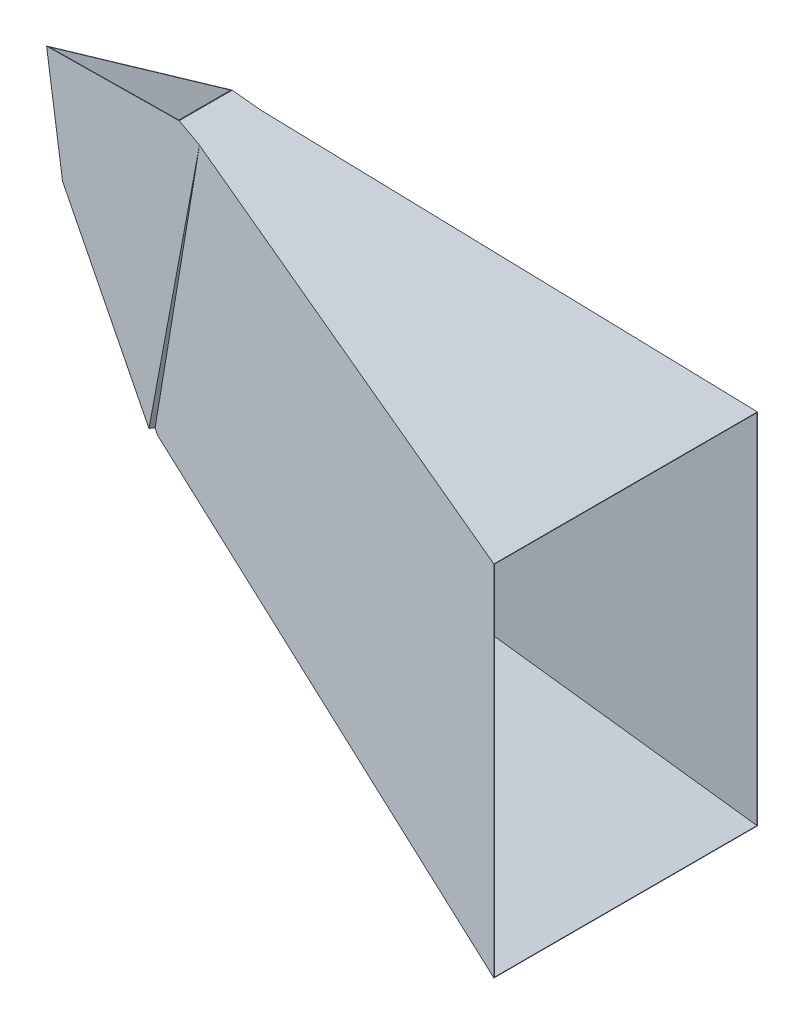
ISO-10303-21;
HEADER;
FILE_DESCRIPTION(('STEP AP214'),'2;1');
FILE_NAME('part.step','',(''),(''),'','','');
FILE_SCHEMA(('AUTOMOTIVE_DESIGN { 1 0 10303 214 1 1 1 1 }'));
ENDSEC;
DATA;
#1=APPLICATION_CONTEXT('core data for automotive mechanical design processes');
#2=APPLICATION_PROTOCOL_DEFINITION('international standard','automotive_design',2000,#1);
#3=PRODUCT_CONTEXT('',#1,'mechanical');
#4=PRODUCT('Part','Part','',(#3));
#5=PRODUCT_RELATED_PRODUCT_CATEGORY('part','',(#4));
#6=PRODUCT_DEFINITION_FORMATION('','',#4);
#7=PRODUCT_DEFINITION_CONTEXT('part definition',#1,'design');
#8=PRODUCT_DEFINITION('design','',#6,#7);
#9=PRODUCT_DEFINITION_SHAPE('','',#8);
#10=(LENGTH_UNIT() NAMED_UNIT(*) SI_UNIT(.MILLI.,.METRE.));
#11=(NAMED_UNIT(*) PLANE_ANGLE_UNIT() SI_UNIT($,.RADIAN.));
#12=(NAMED_UNIT(*) SI_UNIT($,.STERADIAN.) SOLID_ANGLE_UNIT());
#13=UNCERTAINTY_MEASURE_WITH_UNIT(LENGTH_MEASURE(1.E-05),#10,'distance_accuracy_value','');
#14=(GEOMETRIC_REPRESENTATION_CONTEXT(3) GLOBAL_UNCERTAINTY_ASSIGNED_CONTEXT((#13)) GLOBAL_UNIT_ASSIGNED_CONTEXT((#10,
#11,#12)) REPRESENTATION_CONTEXT('',''));
#15=CARTESIAN_POINT('',(0.,0.,0.));
#16=DIRECTION('',(0.,0.,1.));
#17=DIRECTION('',(1.,0.,0.));
#18=AXIS2_PLACEMENT_3D('',#15,#16,#17);
#19=CARTESIAN_POINT('',(-2618.,2991.,-821.33));
#20=DIRECTION('',(-0.17380459295499,0.984780159968584,0.));
#21=DIRECTION('',(-0.984780159968584,-0.17380459295499,0.));
#22=AXIS2_PLACEMENT_3D('',#19,#20,#21);
#23=PLANE('',#22);
#24=DIRECTION('',(0.,0.,1.));
#25=VECTOR('',#24,1.);
#26=CARTESIAN_POINT('',(-2618.,2991.,-821.33));
#27=LINE('',#26,#25);
#28=CARTESIAN_POINT('',(-2618.,2991.,-165.16039801311));
#29=VERTEX_POINT('',#28);
#30=CARTESIAN_POINT('',(-2618.,2991.,165.118310269719));
#31=VERTEX_POINT('',#30);
#32=EDGE_CURVE('E354',#29,#31,#27,.T.);
#33=ORIENTED_EDGE('',*,*,#32,.F.);
#34=DIRECTION('',(-0.971798950171605,-0.171513529450117,0.161832968399307));
#35=VECTOR('',#34,1.);
#36=CARTESIAN_POINT('',(-2514.80479147807,3009.213000161,-182.345420611396));
#37=LINE('',#36,#35);
#38=CARTESIAN_POINT('',(-3609.78,2815.96,-2.22044604925031E-13));
#39=VERTEX_POINT('',#38);
#40=EDGE_CURVE('E283',#29,#39,#37,.T.);
#41=ORIENTED_EDGE('',*,*,#40,.T.);
#42=DIRECTION('',(0.971805435159267,0.171514673990479,0.161792808248228));
#43=VECTOR('',#42,1.);
#44=CARTESIAN_POINT('',(-2773.10038292984,2963.62621647135,139.296138869245));
#45=LINE('',#44,#43);
#46=EDGE_CURVE('E302',#39,#31,#45,.T.);
#47=ORIENTED_EDGE('',*,*,#46,.T.);
#48=EDGE_LOOP('',(#33,#41,#47));
#49=FACE_BOUND('',#48,.T.);
#50=DIRECTION('',(-0.971798950171605,-0.171513529450117,0.161832968399307));
#51=VECTOR('',#50,1.);
#52=CARTESIAN_POINT('',(-2514.40620425464,3009.2833471206,-179.877369110171));
#53=LINE('',#52,#51);
#54=CARTESIAN_POINT('',(-2623.59288098615,2990.01290821773,-161.694591693098));
#55=VERTEX_POINT('',#54);
#56=CARTESIAN_POINT('',(-3594.55899883739,2818.64636597179,-0.00031425096982951));
#57=VERTEX_POINT('',#56);
#58=EDGE_CURVE('E207',#55,#57,#53,.T.);
#59=ORIENTED_EDGE('',*,*,#58,.F.);
#60=DIRECTION('',(0.,0.,1.));
#61=VECTOR('',#60,1.);
#62=CARTESIAN_POINT('',(-2623.59288098615,2990.01290821773,-821.33));
#63=LINE('',#62,#61);
#64=CARTESIAN_POINT('',(-2623.59288098615,2990.01290821773,161.652758717577));
#65=VERTEX_POINT('',#64);
#66=EDGE_CURVE('E180',#55,#65,#63,.T.);
#67=ORIENTED_EDGE('',*,*,#66,.T.);
#68=DIRECTION('',(0.971805435159267,0.171514673990479,0.161792808248228));
#69=VECTOR('',#68,1.);
#70=CARTESIAN_POINT('',(-2772.70189469963,2963.69654595956,136.828071397451));
#71=LINE('',#70,#69);
#72=EDGE_CURVE('E187',#57,#65,#71,.T.);
#73=ORIENTED_EDGE('',*,*,#72,.F.);
#74=EDGE_LOOP('',(#59,#67,#73));
#75=FACE_BOUND('',#74,.T.);
#76=ADVANCED_FACE('F38',(#49,#75),#23,.T.);
#77=CARTESIAN_POINT('',(-2819.61,1161.48,-821.33));
#78=DIRECTION('',(-0.828935245995771,-0.559344578900995,0.));
#79=DIRECTION('',(0.559344578900995,-0.828935245995771,0.));
#80=AXIS2_PLACEMENT_3D('',#77,#78,#79);
#81=PLANE('',#80);
#82=DIRECTION('',(0.,0.,1.));
#83=VECTOR('',#82,1.);
#84=CARTESIAN_POINT('',(-3490.66,2155.96,-821.33));
#85=LINE('',#84,#83);
#86=CARTESIAN_POINT('',(-3490.66,2155.96,-19.8369664757524));
#87=VERTEX_POINT('',#86);
#88=CARTESIAN_POINT('',(-3490.66,2155.96,19.8319114312941));
#89=VERTEX_POINT('',#88);
#90=EDGE_CURVE('E352',#87,#89,#85,.T.);
#91=ORIENTED_EDGE('',*,*,#90,.F.);
#92=DIRECTION('',(0.556933704736897,-0.825362388326875,-0.0927457625090863));
#93=VECTOR('',#92,1.);
#94=CARTESIAN_POINT('',(-2783.98250918488,1108.68091339568,-137.519452157992));
#95=LINE('',#94,#93);
#96=CARTESIAN_POINT('',(-2825.57183634467,1170.31529842493,-130.593611924464));
#97=VERTEX_POINT('',#96);
#98=EDGE_CURVE('E279',#87,#97,#95,.T.);
#99=ORIENTED_EDGE('',*,*,#98,.T.);
#100=DIRECTION('',(0.184023503464713,-0.272718416996628,0.944330458686696));
#101=VECTOR('',#100,1.);
#102=CARTESIAN_POINT('',(-2944.96200566314,1347.248664916,-743.253251766688));
#103=LINE('',#102,#101);
#104=CARTESIAN_POINT('',(-2819.61,1161.48,-100.));
#105=VERTEX_POINT('',#104);
#106=EDGE_CURVE('E321',#97,#105,#103,.T.);
#107=ORIENTED_EDGE('',*,*,#106,.T.);
#108=DIRECTION('',(0.,0.,1.));
#109=VECTOR('',#108,1.);
#110=CARTESIAN_POINT('',(-2819.61,1161.48,-821.33));
#111=LINE('',#110,#109);
#112=CARTESIAN_POINT('',(-2819.61,1161.48,100.));
#113=VERTEX_POINT('',#112);
#114=EDGE_CURVE('E48',#105,#113,#111,.T.);
#115=ORIENTED_EDGE('',*,*,#114,.T.);
#116=DIRECTION('',(0.553704431133627,-0.820576682324372,0.141652078588748));
#117=VECTOR('',#116,1.);
#118=CARTESIAN_POINT('',(-2891.87302930655,1268.57207567957,81.5132266768481));
#119=LINE('',#118,#117);
#120=CARTESIAN_POINT('',(-2837.89686803155,1188.58069967962,95.3217407665619));
#121=VERTEX_POINT('',#120);
#122=EDGE_CURVE('E333',#121,#113,#119,.T.);
#123=ORIENTED_EDGE('',*,*,#122,.F.);
#124=DIRECTION('',(0.181466893831261,-0.268929582858673,-0.945910485144707));
#125=VECTOR('',#124,1.);
#126=CARTESIAN_POINT('',(-2678.62752477108,952.547354197664,-734.882262682545));
#127=LINE('',#126,#125);
#128=CARTESIAN_POINT('',(-2844.06645933088,1197.72388596285,127.481221627709));
#129=VERTEX_POINT('',#128);
#130=EDGE_CURVE('E340',#129,#121,#127,.T.);
#131=ORIENTED_EDGE('',*,*,#130,.F.);
#132=DIRECTION('',(-0.556934925376517,0.825364197285507,-0.0927223313722426));
#133=VECTOR('',#132,1.);
#134=CARTESIAN_POINT('',(-2868.81716330611,1234.40383542905,123.360555332385));
#135=LINE('',#134,#133);
#136=EDGE_CURVE('E298',#129,#89,#135,.T.);
#137=ORIENTED_EDGE('',*,*,#136,.T.);
#138=EDGE_LOOP('',(#91,#99,#107,#115,#123,#131,#137));
#139=FACE_BOUND('',#138,.T.);
#140=ADVANCED_FACE('F377',(#139),#81,.T.);
#141=CARTESIAN_POINT('',(0.,2235.,-821.33));
#142=DIRECTION('',(0.277434275021273,0.960744619055148,0.));
#143=DIRECTION('',(-0.960744619055148,0.277434275021273,0.));
#144=AXIS2_PLACEMENT_3D('',#141,#142,#143);
#145=PLANE('',#144);
#146=DIRECTION('',(-0.932977433111524,0.269415943251456,0.238680034411261));
#147=VECTOR('',#146,1.);
#148=CARTESIAN_POINT('',(0.,2235.,-821.33));
#149=LINE('',#148,#147);
#150=CARTESIAN_POINT('',(0.,2235.,-821.33));
#151=VERTEX_POINT('',#150);
#152=CARTESIAN_POINT('',(-2465.88624153706,2947.07410183423,-190.491790954094));
#153=VERTEX_POINT('',#152);
#154=EDGE_CURVE('E317',#151,#153,#149,.T.);
#155=ORIENTED_EDGE('',*,*,#154,.T.);
#156=DIRECTION('',(-0.948679443110456,0.273950213518527,0.157982893797998));
#157=VECTOR('',#156,1.);
#158=CARTESIAN_POINT('',(33.0018992616001,2225.47003978542,-606.629805357033));
#159=LINE('',#158,#157);
#160=EDGE_CURVE('E275',#153,#29,#159,.T.);
#161=ORIENTED_EDGE('',*,*,#160,.T.);
#162=ORIENTED_EDGE('',*,*,#32,.T.);
#163=DIRECTION('',(0.948685476177381,-0.273951955687586,0.157943639520693));
#164=VECTOR('',#163,1.);
#165=CARTESIAN_POINT('',(-213.11740140898,2296.54192340152,565.499595510802));
#166=LINE('',#165,#164);
#167=CARTESIAN_POINT('',(-2466.4295960794,2947.23100635448,190.352786647815));
#168=VERTEX_POINT('',#167);
#169=EDGE_CURVE('E294',#31,#168,#166,.T.);
#170=ORIENTED_EDGE('',*,*,#169,.T.);
#171=DIRECTION('',(-0.932977433111524,0.269415943251456,-0.238680034411261));
#172=VECTOR('',#171,1.);
#173=CARTESIAN_POINT('',(-365.792597785915,2340.62994802374,727.750684221962));
#174=LINE('',#173,#172);
#175=CARTESIAN_POINT('',(0.,2235.,821.33));
#176=VERTEX_POINT('',#175);
#177=EDGE_CURVE('E329',#176,#168,#174,.T.);
#178=ORIENTED_EDGE('',*,*,#177,.F.);
#179=DIRECTION('',(0.,0.,1.));
#180=VECTOR('',#179,1.);
#181=CARTESIAN_POINT('',(0.,2235.,-821.33));
#182=LINE('',#181,#180);
#183=EDGE_CURVE('E42',#151,#176,#182,.T.);
#184=ORIENTED_EDGE('',*,*,#183,.F.);
#185=EDGE_LOOP('',(#155,#161,#162,#170,#178,#184));
#186=FACE_BOUND('',#185,.T.);
#187=ADVANCED_FACE('F366',(#186),#145,.T.);
#188=CARTESIAN_POINT('',(-3490.66,2155.96,-821.33));
#189=DIRECTION('',(-0.984100025713585,-0.177615144034852,0.));
#190=DIRECTION('',(0.177615144034852,-0.984100025713585,0.));
#191=AXIS2_PLACEMENT_3D('',#188,#189,#190);
#192=PLANE('',#191);
#193=DIRECTION('',(-0.17753753986495,0.983670049621115,-0.0295576625783375));
#194=VECTOR('',#193,1.);
#195=CARTESIAN_POINT('',(-3495.07407678685,2180.41677198894,19.0970257707184));
#196=LINE('',#195,#194);
#197=EDGE_CURVE('E306',#89,#39,#196,.T.);
#198=ORIENTED_EDGE('',*,*,#197,.T.);
#199=DIRECTION('',(0.177537500324102,-0.983669830539855,-0.0295651900782244));
#200=VECTOR('',#199,1.);
#201=CARTESIAN_POINT('',(-3486.45301921715,2132.65067061216,-20.5375519085386));
#202=LINE('',#201,#200);
#203=EDGE_CURVE('E287',#39,#87,#202,.T.);
#204=ORIENTED_EDGE('',*,*,#203,.T.);
#205=ORIENTED_EDGE('',*,*,#90,.T.);
#206=EDGE_LOOP('',(#198,#204,#205));
#207=FACE_BOUND('',#206,.T.);
#208=ADVANCED_FACE('F398',(#207),#192,.T.);
#209=CARTESIAN_POINT('',(-3324.72159323004,2991.,-3583.83713471968));
#210=DIRECTION('',(0.949160189456234,-0.200333170079366,-0.242820006830897));
#211=DIRECTION('',(-0.247844349608384,0.,-0.968799864970674));
#212=AXIS2_PLACEMENT_3D('',#209,#210,#211);
#213=PLANE('',#212);
#214=ORIENTED_EDGE('',*,*,#106,.F.);
#215=DIRECTION('',(0.198306109594362,0.979583644933264,-0.0330237713898608));
#216=VECTOR('',#215,1.);
#217=CARTESIAN_POINT('',(-2468.90488590454,2932.16273748797,-189.989098315412));
#218=LINE('',#217,#216);
#219=EDGE_CURVE('E251',#97,#153,#218,.T.);
#220=ORIENTED_EDGE('',*,*,#219,.T.);
#221=DIRECTION('',(0.194082748122037,0.979727830045647,-0.0496514442433065));
#222=VECTOR('',#221,1.);
#223=CARTESIAN_POINT('',(-2457.18458096532,2991.,-192.717903366879));
#224=LINE('',#223,#222);
#225=EDGE_CURVE('E313',#105,#153,#224,.T.);
#226=ORIENTED_EDGE('',*,*,#225,.F.);
#227=EDGE_LOOP('',(#214,#220,#226));
#228=FACE_BOUND('',#227,.T.);
#229=ADVANCED_FACE('F388',(#228),#213,.T.);
#230=CARTESIAN_POINT('',(-3322.04254062299,1161.48,1963.96076118556));
#231=DIRECTION('',(-0.946563572848116,0.213021143809366,-0.242155724374127));
#232=DIRECTION('',(-0.247844349608384,0.,0.968799864970674));
#233=AXIS2_PLACEMENT_3D('',#230,#231,#232);
#234=PLANE('',#233);
#235=DIRECTION('',(0.210863807382627,0.97688485512901,0.0351060472807063));
#236=VECTOR('',#235,1.);
#237=CARTESIAN_POINT('',(-2859.19012232568,1127.65933805832,124.96333088703));
#238=LINE('',#237,#236);
#239=EDGE_CURVE('E291',#129,#168,#238,.T.);
#240=ORIENTED_EDGE('',*,*,#239,.F.);
#241=ORIENTED_EDGE('',*,*,#130,.T.);
#242=DIRECTION('',(0.206374855358412,0.977047589572867,0.0527960868402664));
#243=VECTOR('',#242,1.);
#244=CARTESIAN_POINT('',(-2843.62115724343,1161.48,93.8573178367198));
#245=LINE('',#244,#243);
#246=EDGE_CURVE('E325',#121,#168,#245,.T.);
#247=ORIENTED_EDGE('',*,*,#246,.T.);
#248=EDGE_LOOP('',(#240,#241,#247));
#249=FACE_BOUND('',#248,.T.);
#250=ADVANCED_FACE('F373',(#249),#234,.F.);
#251=CARTESIAN_POINT('',(0.,0.,-821.33));
#252=DIRECTION('',(-0.380879933926362,-0.924624505370829,0.));
#253=DIRECTION('',(0.924624505370829,-0.380879933926362,0.));
#254=AXIS2_PLACEMENT_3D('',#251,#252,#253);
#255=PLANE('',#254);
#256=ORIENTED_EDGE('',*,*,#114,.F.);
#257=DIRECTION('',(-0.899794172231629,0.370651591944841,0.230190888192282));
#258=VECTOR('',#257,1.);
#259=CARTESIAN_POINT('',(-2819.61,1161.48,-100.));
#260=LINE('',#259,#258);
#261=CARTESIAN_POINT('',(0.,0.,-821.33));
#262=VERTEX_POINT('',#261);
#263=EDGE_CURVE('E310',#262,#105,#260,.T.);
#264=ORIENTED_EDGE('',*,*,#263,.F.);
#265=DIRECTION('',(0.,0.,1.));
#266=VECTOR('',#265,1.);
#267=CARTESIAN_POINT('',(0.,0.,-821.33));
#268=LINE('',#267,#266);
#269=CARTESIAN_POINT('',(0.,0.,821.33));
#270=VERTEX_POINT('',#269);
#271=EDGE_CURVE('E11',#262,#270,#268,.T.);
#272=ORIENTED_EDGE('',*,*,#271,.T.);
#273=DIRECTION('',(0.899794172231629,-0.370651591944841,0.230190888192282));
#274=VECTOR('',#273,1.);
#275=CARTESIAN_POINT('',(-340.234999258223,140.152768268818,734.288986521209));
#276=LINE('',#275,#274);
#277=EDGE_CURVE('E337',#113,#270,#276,.T.);
#278=ORIENTED_EDGE('',*,*,#277,.F.);
#279=EDGE_LOOP('',(#256,#264,#272,#278));
#280=FACE_BOUND('',#279,.T.);
#281=ADVANCED_FACE('F381',(#280),#255,.T.);
#282=CARTESIAN_POINT('',(0.,0.,-821.33));
#283=DIRECTION('',(1.,0.,0.));
#284=DIRECTION('',(0.,0.,-1.));
#285=AXIS2_PLACEMENT_3D('',#282,#283,#284);
#286=PLANE('',#285);
#287=DIRECTION('',(0.,0.,1.));
#288=VECTOR('',#287,1.);
#289=CARTESIAN_POINT('',(0.,2232.39785167628,-821.33));
#290=LINE('',#289,#288);
#291=CARTESIAN_POINT('',(0.,2232.39785167628,-818.749487666758));
#292=VERTEX_POINT('',#291);
#293=CARTESIAN_POINT('',(0.,2232.39785167628,818.749487666758));
#294=VERTEX_POINT('',#293);
#295=EDGE_CURVE('E256',#292,#294,#290,.T.);
#296=ORIENTED_EDGE('',*,*,#295,.F.);
#297=DIRECTION('',(0.,1.,0.));
#298=VECTOR('',#297,1.);
#299=CARTESIAN_POINT('',(0.,0.,-818.749487666758));
#300=LINE('',#299,#298);
#301=CARTESIAN_POINT('',(0.,2.70380028376747,-818.749487666758));
#302=VERTEX_POINT('',#301);
#303=EDGE_CURVE('E262',#302,#292,#300,.T.);
#304=ORIENTED_EDGE('',*,*,#303,.F.);
#305=DIRECTION('',(0.,0.,1.));
#306=VECTOR('',#305,1.);
#307=CARTESIAN_POINT('',(0.,2.70380028376747,-821.33));
#308=LINE('',#307,#306);
#309=CARTESIAN_POINT('',(0.,2.70380028376747,818.749487666758));
#310=VERTEX_POINT('',#309);
#311=EDGE_CURVE('E64',#302,#310,#308,.T.);
#312=ORIENTED_EDGE('',*,*,#311,.T.);
#313=DIRECTION('',(0.,1.,0.));
#314=VECTOR('',#313,1.);
#315=CARTESIAN_POINT('',(0.,0.,818.749487666758));
#316=LINE('',#315,#314);
#317=EDGE_CURVE('E263',#310,#294,#316,.T.);
#318=ORIENTED_EDGE('',*,*,#317,.T.);
#319=EDGE_LOOP('',(#296,#304,#312,#318));
#320=FACE_BOUND('',#319,.T.);
#321=ORIENTED_EDGE('',*,*,#183,.T.);
#322=DIRECTION('',(0.,1.,0.));
#323=VECTOR('',#322,1.);
#324=CARTESIAN_POINT('',(0.,0.,821.33));
#325=LINE('',#324,#323);
#326=EDGE_CURVE('E343',#270,#176,#325,.T.);
#327=ORIENTED_EDGE('',*,*,#326,.F.);
#328=ORIENTED_EDGE('',*,*,#271,.F.);
#329=DIRECTION('',(0.,1.,0.));
#330=VECTOR('',#329,1.);
#331=CARTESIAN_POINT('',(0.,0.,-821.33));
#332=LINE('',#331,#330);
#333=EDGE_CURVE('E346',#262,#151,#332,.T.);
#334=ORIENTED_EDGE('',*,*,#333,.T.);
#335=EDGE_LOOP('',(#321,#327,#328,#334));
#336=FACE_BOUND('',#335,.T.);
#337=ADVANCED_FACE('F40',(#320,#336),#286,.T.);
#338=CARTESIAN_POINT('',(-197.210837787503,0.,770.87830858833));
#339=DIRECTION('',(0.247844349608384,0.,-0.968799864970674));
#340=DIRECTION('',(-0.968799864970674,0.,-0.247844349608384));
#341=AXIS2_PLACEMENT_3D('',#338,#339,#340);
#342=PLANE('',#341);
#343=ORIENTED_EDGE('',*,*,#177,.T.);
#344=ORIENTED_EDGE('',*,*,#246,.F.);
#345=ORIENTED_EDGE('',*,*,#122,.T.);
#346=ORIENTED_EDGE('',*,*,#277,.T.);
#347=ORIENTED_EDGE('',*,*,#326,.T.);
#348=EDGE_LOOP('',(#343,#344,#345,#346,#347));
#349=FACE_BOUND('',#348,.T.);
#350=ADVANCED_FACE('F369',(#349),#342,.F.);
#351=CARTESIAN_POINT('',(-197.210837787502,0.,-770.87830858833));
#352=DIRECTION('',(-0.247844349608384,0.,-0.968799864970674));
#353=DIRECTION('',(-0.968799864970674,0.,0.247844349608384));
#354=AXIS2_PLACEMENT_3D('',#351,#352,#353);
#355=PLANE('',#354);
#356=ORIENTED_EDGE('',*,*,#225,.T.);
#357=ORIENTED_EDGE('',*,*,#154,.F.);
#358=ORIENTED_EDGE('',*,*,#333,.F.);
#359=ORIENTED_EDGE('',*,*,#263,.T.);
#360=EDGE_LOOP('',(#356,#357,#358,#359));
#361=FACE_BOUND('',#360,.T.);
#362=ADVANCED_FACE('F384',(#361),#355,.T.);
#363=CARTESIAN_POINT('',(-97.3568709534408,3500.33,584.772199500341));
#364=DIRECTION('',(-0.164226386228659,0.,0.986422675158208));
#365=DIRECTION('',(0.986422675158208,0.,0.164226386228659));
#366=AXIS2_PLACEMENT_3D('',#363,#364,#365);
#367=PLANE('',#366);
#368=ORIENTED_EDGE('',*,*,#136,.F.);
#369=ORIENTED_EDGE('',*,*,#239,.T.);
#370=ORIENTED_EDGE('',*,*,#169,.F.);
#371=ORIENTED_EDGE('',*,*,#46,.F.);
#372=ORIENTED_EDGE('',*,*,#197,.F.);
#373=EDGE_LOOP('',(#368,#369,#370,#371,#372));
#374=FACE_BOUND('',#373,.T.);
#375=ADVANCED_FACE('F396',(#374),#367,.T.);
#376=CARTESIAN_POINT('',(-97.4051693236694,3500.33,-584.913211605126));
#377=DIRECTION('',(-0.164267117217789,0.,-0.986415893120623));
#378=DIRECTION('',(-0.986415893120623,0.,0.164267117217789));
#379=AXIS2_PLACEMENT_3D('',#376,#377,#378);
#380=PLANE('',#379);
#381=ORIENTED_EDGE('',*,*,#40,.F.);
#382=ORIENTED_EDGE('',*,*,#160,.F.);
#383=ORIENTED_EDGE('',*,*,#219,.F.);
#384=ORIENTED_EDGE('',*,*,#98,.F.);
#385=ORIENTED_EDGE('',*,*,#203,.F.);
#386=EDGE_LOOP('',(#381,#382,#383,#384,#385));
#387=FACE_BOUND('',#386,.T.);
#388=ADVANCED_FACE('F390',(#387),#380,.T.);
#389=CARTESIAN_POINT('',(-2817.53766188501,1162.87836144725,-821.33));
#390=DIRECTION('',(-0.828935245995771,-0.559344578900995,0.));
#391=DIRECTION('',(0.559344578900995,-0.828935245995771,0.));
#392=AXIS2_PLACEMENT_3D('',#389,#390,#391);
#393=PLANE('',#392);
#394=DIRECTION('',(0.,0.,1.));
#395=VECTOR('',#394,1.);
#396=CARTESIAN_POINT('',(-3488.29324084791,2156.92203653409,-821.33));
#397=LINE('',#396,#395);
#398=CARTESIAN_POINT('',(-3488.29324084791,2156.92203653409,-17.6966732062897));
#399=VERTEX_POINT('',#398);
#400=CARTESIAN_POINT('',(-3488.29324084791,2156.92203653409,17.6915351498588));
#401=VERTEX_POINT('',#400);
#402=EDGE_CURVE('E166',#399,#401,#397,.T.);
#403=ORIENTED_EDGE('',*,*,#402,.T.);
#404=DIRECTION('',(-0.556934925376517,0.825364197285507,-0.0927223313722426));
#405=VECTOR('',#404,1.);
#406=CARTESIAN_POINT('',(-2866.6317642433,1235.63464326421,121.18998498423));
#407=LINE('',#406,#405);
#408=CARTESIAN_POINT('',(-2844.78363790865,1203.25624422199,124.827410323455));
#409=VERTEX_POINT('',#408);
#410=EDGE_CURVE('E170',#409,#401,#407,.T.);
#411=ORIENTED_EDGE('',*,*,#410,.F.);
#412=DIRECTION('',(0.181466893831261,-0.268929582858673,-0.945910485144707));
#413=VECTOR('',#412,1.);
#414=CARTESIAN_POINT('',(-2679.50662788608,958.319680736044,-736.692029575514));
#415=LINE('',#414,#413);
#416=CARTESIAN_POINT('',(-2838.59389922238,1194.0831999947,92.5629096201215));
#417=VERTEX_POINT('',#416);
#418=EDGE_CURVE('E202',#409,#417,#415,.T.);
#419=ORIENTED_EDGE('',*,*,#418,.T.);
#420=DIRECTION('',(0.553704431133627,-0.820576682324372,0.141652078588748));
#421=VECTOR('',#420,1.);
#422=CARTESIAN_POINT('',(-2889.6398749874,1269.7321113706,79.5040136385562));
#423=LINE('',#422,#421);
#424=CARTESIAN_POINT('',(-2817.95986965286,1163.5040632295,97.8416341775519));
#425=VERTEX_POINT('',#424);
#426=EDGE_CURVE('E223',#417,#425,#423,.T.);
#427=ORIENTED_EDGE('',*,*,#426,.T.);
#428=DIRECTION('',(0.,0.,1.));
#429=VECTOR('',#428,1.);
#430=CARTESIAN_POINT('',(-2817.95986965286,1163.5040632295,-821.33));
#431=LINE('',#430,#429);
#432=CARTESIAN_POINT('',(-2817.95986965286,1163.5040632295,-97.8416341775514));
#433=VERTEX_POINT('',#432);
#434=EDGE_CURVE('E179',#433,#425,#431,.T.);
#435=ORIENTED_EDGE('',*,*,#434,.F.);
#436=DIRECTION('',(0.553704431133627,-0.820576682324372,-0.141652078588748));
#437=VECTOR('',#436,1.);
#438=CARTESIAN_POINT('',(-2760.80049309308,1078.79523855,-112.464498011157));
#439=LINE('',#438,#437);
#440=CARTESIAN_POINT('',(-2820.35761564978,1167.0574652696,-97.2282280256523));
#441=VERTEX_POINT('',#440);
#442=EDGE_CURVE('E242',#441,#433,#439,.T.);
#443=ORIENTED_EDGE('',*,*,#442,.F.);
#444=DIRECTION('',(0.184023503464713,-0.272718416996628,0.944330458686696));
#445=VECTOR('',#444,1.);
#446=CARTESIAN_POINT('',(-2945.88606532067,1353.08761597179,-741.386915498244));
#447=LINE('',#446,#445);
#448=CARTESIAN_POINT('',(-2826.3407509602,1175.92432825076,-127.931137195908));
#449=VERTEX_POINT('',#448);
#450=EDGE_CURVE('E213',#449,#441,#447,.T.);
#451=ORIENTED_EDGE('',*,*,#450,.F.);
#452=DIRECTION('',(0.556933704736897,-0.825362388326875,-0.0927457625090863));
#453=VECTOR('',#452,1.);
#454=CARTESIAN_POINT('',(-2781.79708544164,1109.91168465505,-135.348961235521));
#455=LINE('',#454,#453);
#456=EDGE_CURVE('E174',#399,#449,#455,.T.);
#457=ORIENTED_EDGE('',*,*,#456,.F.);
#458=EDGE_LOOP('',(#403,#411,#419,#427,#435,#443,#451,#457));
#459=FACE_BOUND('',#458,.T.);
#460=ADVANCED_FACE('F168',(#459),#393,.F.);
#461=CARTESIAN_POINT('',(-0.693585687553181,2232.59813845236,-821.33));
#462=DIRECTION('',(0.277434275021273,0.960744619055148,0.));
#463=DIRECTION('',(-0.960744619055148,0.277434275021273,0.));
#464=AXIS2_PLACEMENT_3D('',#461,#462,#463);
#465=PLANE('',#464);
#466=DIRECTION('',(-0.932977433111524,0.269415943251456,0.238680034411261));
#467=VECTOR('',#466,1.);
#468=CARTESIAN_POINT('',(-0.0794369385303135,2232.42079068526,-818.729165619783));
#469=LINE('',#468,#467);
#470=CARTESIAN_POINT('',(-2468.12609668303,2945.11875660079,-187.338265079105));
#471=VERTEX_POINT('',#470);
#472=EDGE_CURVE('E210',#292,#471,#469,.T.);
#473=ORIENTED_EDGE('',*,*,#472,.F.);
#474=ORIENTED_EDGE('',*,*,#295,.T.);
#475=DIRECTION('',(-0.932977433111524,0.269415943251456,-0.238680034411261));
#476=VECTOR('',#475,1.);
#477=CARTESIAN_POINT('',(-365.872034724446,2338.050738709,725.149849841745));
#478=LINE('',#477,#476);
#479=CARTESIAN_POINT('',(-2468.70003010946,2945.28449138703,187.191437894323));
#480=VERTEX_POINT('',#479);
#481=EDGE_CURVE('E219',#294,#480,#478,.T.);
#482=ORIENTED_EDGE('',*,*,#481,.T.);
#483=DIRECTION('',(0.23304144194119,-0.0672953896514665,-0.970135566232693));
#484=VECTOR('',#483,1.);
#485=CARTESIAN_POINT('',(-2888.76409561744,3066.58641404709,1935.88938041923));
#486=LINE('',#485,#484);
#487=CARTESIAN_POINT('',(-2468.75752995098,2945.30109561934,187.43080579752));
#488=VERTEX_POINT('',#487);
#489=EDGE_CURVE('E246',#488,#480,#486,.T.);
#490=ORIENTED_EDGE('',*,*,#489,.F.);
#491=DIRECTION('',(0.948685476177381,-0.273951955687586,0.157943639520693));
#492=VECTOR('',#491,1.);
#493=CARTESIAN_POINT('',(-213.413931650236,2294.02540413143,562.915816615492));
#494=LINE('',#493,#492);
#495=EDGE_CURVE('E195',#65,#488,#494,.T.);
#496=ORIENTED_EDGE('',*,*,#495,.F.);
#497=ORIENTED_EDGE('',*,*,#66,.F.);
#498=DIRECTION('',(-0.948679443110456,0.273950213518527,0.157982893797998));
#499=VECTOR('',#498,1.);
#500=CARTESIAN_POINT('',(32.705472199177,2222.95349072036,-604.046013635118));
#501=LINE('',#500,#499);
#502=CARTESIAN_POINT('',(-2468.1831469682,2945.13523101469,-187.574861032584));
#503=VERTEX_POINT('',#502);
#504=EDGE_CURVE('E215',#503,#55,#501,.T.);
#505=ORIENTED_EDGE('',*,*,#504,.F.);
#506=DIRECTION('',(0.233875924909514,-0.0675363633428544,0.969917981776883));
#507=VECTOR('',#506,1.);
#508=CARTESIAN_POINT('',(-3286.16819621881,3181.3448174293,-3579.87959868256));
#509=LINE('',#508,#507);
#510=EDGE_CURVE('E238',#503,#471,#509,.T.);
#511=ORIENTED_EDGE('',*,*,#510,.T.);
#512=EDGE_LOOP('',(#473,#474,#482,#490,#496,#497,#505,#511));
#513=FACE_BOUND('',#512,.T.);
#514=ADVANCED_FACE('F456',(#513),#465,.F.);
#515=CARTESIAN_POINT('',(-3488.19974993572,2156.40403786009,-821.33));
#516=DIRECTION('',(-0.984100025713585,-0.177615144034852,0.));
#517=DIRECTION('',(0.177615144034852,-0.984100025713585,0.));
#518=AXIS2_PLACEMENT_3D('',#515,#516,#517);
#519=PLANE('',#518);
#520=DIRECTION('',(-0.17753753986495,0.983670049621115,-0.0295576625783375));
#521=VECTOR('',#520,1.);
#522=CARTESIAN_POINT('',(-3492.60267657418,2180.79903098793,16.9740708479587));
#523=LINE('',#522,#521);
#524=CARTESIAN_POINT('',(-3594.55899883739,2745.70142096203,-0.000314250969746244));
#525=VERTEX_POINT('',#524);
#526=EDGE_CURVE('E182',#401,#525,#523,.T.);
#527=ORIENTED_EDGE('',*,*,#526,.F.);
#528=ORIENTED_EDGE('',*,*,#402,.F.);
#529=DIRECTION('',(0.177537500324102,-0.983669830539855,-0.0295651900782244));
#530=VECTOR('',#529,1.);
#531=CARTESIAN_POINT('',(-3483.98161662389,2133.03291642115,-18.414684834798));
#532=LINE('',#531,#530);
#533=EDGE_CURVE('E184',#525,#399,#532,.T.);
#534=ORIENTED_EDGE('',*,*,#533,.F.);
#535=EDGE_LOOP('',(#527,#528,#534));
#536=FACE_BOUND('',#535,.T.);
#537=ADVANCED_FACE('F183',(#536),#519,.F.);
#538=CARTESIAN_POINT('',(-3327.09449370368,2991.5008329252,-3583.2300847026));
#539=DIRECTION('',(0.949160189456234,-0.200333170079366,-0.242820006830897));
#540=DIRECTION('',(-0.247844349608384,0.,-0.968799864970674));
#541=AXIS2_PLACEMENT_3D('',#538,#539,#540);
#542=PLANE('',#541);
#543=ORIENTED_EDGE('',*,*,#450,.T.);
#544=DIRECTION('',(0.194082748122037,0.979727830045647,-0.0496514442433064));
#545=VECTOR('',#544,1.);
#546=CARTESIAN_POINT('',(-2458.93787056494,2991.5008329252,-189.688853687374));
#547=LINE('',#546,#545);
#548=EDGE_CURVE('E214',#441,#471,#547,.T.);
#549=ORIENTED_EDGE('',*,*,#548,.T.);
#550=ORIENTED_EDGE('',*,*,#510,.F.);
#551=DIRECTION('',(0.198306109594362,0.979583644933264,-0.0330237713898608));
#552=VECTOR('',#551,1.);
#553=CARTESIAN_POINT('',(-2470.71572232786,2932.6249285991,-187.153113110263));
#554=LINE('',#553,#552);
#555=EDGE_CURVE('E218',#449,#503,#554,.T.);
#556=ORIENTED_EDGE('',*,*,#555,.F.);
#557=EDGE_LOOP('',(#543,#549,#550,#556));
#558=FACE_BOUND('',#557,.T.);
#559=ADVANCED_FACE('F449',(#558),#542,.F.);
#560=CARTESIAN_POINT('',(-3324.40894955511,1162.01255285952,1963.35537187463));
#561=DIRECTION('',(-0.946563572848116,0.213021143809366,-0.242155724374127));
#562=DIRECTION('',(-0.247844349608384,0.,0.968799864970674));
#563=AXIS2_PLACEMENT_3D('',#560,#561,#562);
#564=PLANE('',#563);
#565=DIRECTION('',(0.210863807382627,0.97688485512901,0.0351060472807063));
#566=VECTOR('',#565,1.);
#567=CARTESIAN_POINT('',(-2860.99537610795,1128.15088726771,122.12836938897));
#568=LINE('',#567,#566);
#569=EDGE_CURVE('E192',#409,#488,#568,.T.);
#570=ORIENTED_EDGE('',*,*,#569,.T.);
#571=ORIENTED_EDGE('',*,*,#489,.T.);
#572=DIRECTION('',(0.206374855358412,0.977047589572867,0.0527960868402663));
#573=VECTOR('',#572,1.);
#574=CARTESIAN_POINT('',(-2959.47769551581,621.778877446327,61.6376721651755));
#575=LINE('',#574,#573);
#576=EDGE_CURVE('E224',#417,#480,#575,.T.);
#577=ORIENTED_EDGE('',*,*,#576,.F.);
#578=ORIENTED_EDGE('',*,*,#418,.F.);
#579=EDGE_LOOP('',(#570,#571,#577,#578));
#580=FACE_BOUND('',#579,.T.);
#581=ADVANCED_FACE('F446',(#580),#564,.T.);
#582=CARTESIAN_POINT('',(0.952199834815906,2.31156126342707,-821.33));
#583=DIRECTION('',(-0.380879933926362,-0.924624505370829,0.));
#584=DIRECTION('',(0.924624505370829,-0.380879933926362,0.));
#585=AXIS2_PLACEMENT_3D('',#582,#583,#584);
#586=PLANE('',#585);
#587=ORIENTED_EDGE('',*,*,#434,.T.);
#588=DIRECTION('',(0.899794172231629,-0.370651591944841,0.230190888192282));
#589=VECTOR('',#588,1.);
#590=CARTESIAN_POINT('',(-338.798767321128,142.264942522639,732.075899889814));
#591=LINE('',#590,#589);
#592=EDGE_CURVE('E233',#425,#310,#591,.T.);
#593=ORIENTED_EDGE('',*,*,#592,.T.);
#594=ORIENTED_EDGE('',*,*,#311,.F.);
#595=DIRECTION('',(-0.899794172231629,0.370651591944841,0.230190888192282));
#596=VECTOR('',#595,1.);
#597=CARTESIAN_POINT('',(-168.681267692016,72.1885583882298,-775.596406629209));
#598=LINE('',#597,#596);
#599=EDGE_CURVE('E186',#302,#433,#598,.T.);
#600=ORIENTED_EDGE('',*,*,#599,.T.);
#601=EDGE_LOOP('',(#587,#593,#594,#600));
#602=FACE_BOUND('',#601,.T.);
#603=ADVANCED_FACE('F442',(#602),#586,.F.);
#604=CARTESIAN_POINT('',(-196.591226913482,0.,768.456308925903));
#605=DIRECTION('',(0.247844349608384,0.,-0.968799864970674));
#606=DIRECTION('',(-0.968799864970674,0.,-0.247844349608384));
#607=AXIS2_PLACEMENT_3D('',#604,#605,#606);
#608=PLANE('',#607);
#609=ORIENTED_EDGE('',*,*,#481,.F.);
#610=ORIENTED_EDGE('',*,*,#317,.F.);
#611=ORIENTED_EDGE('',*,*,#592,.F.);
#612=ORIENTED_EDGE('',*,*,#426,.F.);
#613=ORIENTED_EDGE('',*,*,#576,.T.);
#614=EDGE_LOOP('',(#609,#610,#611,#612,#613));
#615=FACE_BOUND('',#614,.T.);
#616=ADVANCED_FACE('F438',(#615),#608,.T.);
#617=CARTESIAN_POINT('',(-196.591226913482,0.,-768.456308925903));
#618=DIRECTION('',(-0.247844349608384,0.,-0.968799864970674));
#619=DIRECTION('',(-0.968799864970674,0.,0.247844349608384));
#620=AXIS2_PLACEMENT_3D('',#617,#618,#619);
#621=PLANE('',#620);
#622=ORIENTED_EDGE('',*,*,#548,.F.);
#623=ORIENTED_EDGE('',*,*,#442,.T.);
#624=ORIENTED_EDGE('',*,*,#599,.F.);
#625=ORIENTED_EDGE('',*,*,#303,.T.);
#626=ORIENTED_EDGE('',*,*,#472,.T.);
#627=EDGE_LOOP('',(#622,#623,#624,#625,#626));
#628=FACE_BOUND('',#627,.T.);
#629=ADVANCED_FACE('F435',(#628),#621,.F.);
#630=CARTESIAN_POINT('',(-96.9463049878691,3500.33,582.306142812445));
#631=DIRECTION('',(-0.164226386228659,0.,0.986422675158208));
#632=DIRECTION('',(0.986422675158208,0.,0.164226386228659));
#633=AXIS2_PLACEMENT_3D('',#630,#631,#632);
#634=PLANE('',#633);
#635=ORIENTED_EDGE('',*,*,#410,.T.);
#636=ORIENTED_EDGE('',*,*,#526,.T.);
#637=DIRECTION('',(0.,1.,0.));
#638=VECTOR('',#637,1.);
#639=CARTESIAN_POINT('',(-3594.55899883739,3500.33,-0.000314250969690733));
#640=LINE('',#639,#638);
#641=EDGE_CURVE('E56',#525,#57,#640,.T.);
#642=ORIENTED_EDGE('',*,*,#641,.T.);
#643=ORIENTED_EDGE('',*,*,#72,.T.);
#644=ORIENTED_EDGE('',*,*,#495,.T.);
#645=ORIENTED_EDGE('',*,*,#569,.F.);
#646=EDGE_LOOP('',(#635,#636,#642,#643,#644,#645));
#647=FACE_BOUND('',#646,.T.);
#648=ADVANCED_FACE('F189',(#647),#634,.F.);
#649=CARTESIAN_POINT('',(-96.9945015306249,3500.33,-582.447171872324));
#650=DIRECTION('',(-0.164267117217789,0.,-0.986415893120623));
#651=DIRECTION('',(-0.986415893120623,0.,0.164267117217789));
#652=AXIS2_PLACEMENT_3D('',#649,#650,#651);
#653=PLANE('',#652);
#654=ORIENTED_EDGE('',*,*,#58,.T.);
#655=ORIENTED_EDGE('',*,*,#641,.F.);
#656=ORIENTED_EDGE('',*,*,#533,.T.);
#657=ORIENTED_EDGE('',*,*,#456,.T.);
#658=ORIENTED_EDGE('',*,*,#555,.T.);
#659=ORIENTED_EDGE('',*,*,#504,.T.);
#660=EDGE_LOOP('',(#654,#655,#656,#657,#658,#659));
#661=FACE_BOUND('',#660,.T.);
#662=ADVANCED_FACE('F429',(#661),#653,.F.);
#663=CLOSED_SHELL('',(#76,#140,#187,#208,#229,#250,#281,#337,#350,#362,#375,#388,#460,#514,#537,
#559,#581,#603,#616,#629,#648,#662));
#664=MANIFOLD_SOLID_BREP('B2',#663);
#665=ADVANCED_BREP_SHAPE_REPRESENTATION('',(#18,#664),#14);
#666=SHAPE_DEFINITION_REPRESENTATION(#9,#665);
ENDSEC;
END-ISO-10303-21;
